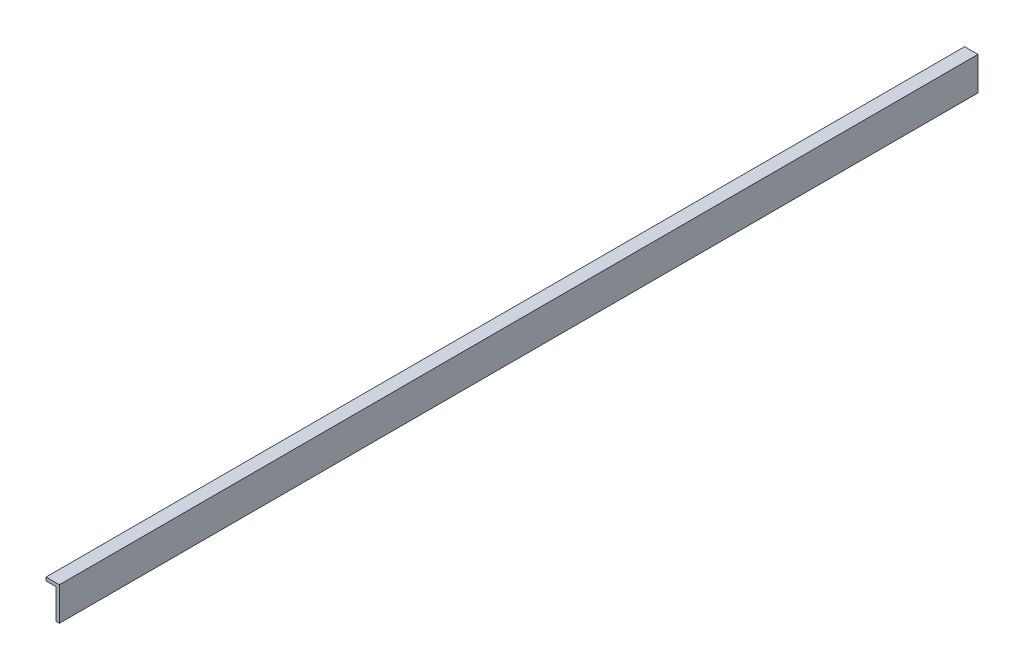
ISO-10303-21;
HEADER;
FILE_DESCRIPTION(('STEP AP214'),'2;1');
FILE_NAME('part.step','',(''),(''),'','','');
FILE_SCHEMA(('AUTOMOTIVE_DESIGN { 1 0 10303 214 1 1 1 1 }'));
ENDSEC;
DATA;
#1=APPLICATION_CONTEXT('core data for automotive mechanical design processes');
#2=APPLICATION_PROTOCOL_DEFINITION('international standard','automotive_design',2000,#1);
#3=PRODUCT_CONTEXT('',#1,'mechanical');
#4=PRODUCT('Part','Part','',(#3));
#5=PRODUCT_RELATED_PRODUCT_CATEGORY('part','',(#4));
#6=PRODUCT_DEFINITION_FORMATION('','',#4);
#7=PRODUCT_DEFINITION_CONTEXT('part definition',#1,'design');
#8=PRODUCT_DEFINITION('design','',#6,#7);
#9=PRODUCT_DEFINITION_SHAPE('','',#8);
#10=(LENGTH_UNIT() NAMED_UNIT(*) SI_UNIT(.MILLI.,.METRE.));
#11=(NAMED_UNIT(*) PLANE_ANGLE_UNIT() SI_UNIT($,.RADIAN.));
#12=(NAMED_UNIT(*) SI_UNIT($,.STERADIAN.) SOLID_ANGLE_UNIT());
#13=UNCERTAINTY_MEASURE_WITH_UNIT(LENGTH_MEASURE(1.E-05),#10,'distance_accuracy_value','');
#14=(GEOMETRIC_REPRESENTATION_CONTEXT(3) GLOBAL_UNCERTAINTY_ASSIGNED_CONTEXT((#13)) GLOBAL_UNIT_ASSIGNED_CONTEXT((#10,
#11,#12)) REPRESENTATION_CONTEXT('',''));
#15=CARTESIAN_POINT('',(0.,0.,0.));
#16=DIRECTION('',(0.,0.,1.));
#17=DIRECTION('',(1.,0.,0.));
#18=AXIS2_PLACEMENT_3D('',#15,#16,#17);
#19=CARTESIAN_POINT('',(164.,888.,-580.));
#20=DIRECTION('',(-1.,0.,0.));
#21=DIRECTION('',(0.,0.,1.));
#22=AXIS2_PLACEMENT_3D('',#19,#20,#21);
#23=PLANE('',#22);
#24=DIRECTION('',(0.,-1.,0.));
#25=VECTOR('',#24,1.);
#26=CARTESIAN_POINT('',(164.,888.,-30.));
#27=LINE('',#26,#25);
#28=CARTESIAN_POINT('',(164.,888.,-30.));
#29=VERTEX_POINT('',#28);
#30=CARTESIAN_POINT('',(164.,870.,-30.));
#31=VERTEX_POINT('',#30);
#32=EDGE_CURVE('E124',#29,#31,#27,.T.);
#33=ORIENTED_EDGE('',*,*,#32,.F.);
#34=DIRECTION('',(0.,0.,1.));
#35=VECTOR('',#34,1.);
#36=CARTESIAN_POINT('',(164.,888.,-580.));
#37=LINE('',#36,#35);
#38=CARTESIAN_POINT('',(164.,888.,-580.));
#39=VERTEX_POINT('',#38);
#40=EDGE_CURVE('E11',#39,#29,#37,.T.);
#41=ORIENTED_EDGE('',*,*,#40,.F.);
#42=DIRECTION('',(0.,-1.,0.));
#43=VECTOR('',#42,1.);
#44=CARTESIAN_POINT('',(164.,888.,-580.));
#45=LINE('',#44,#43);
#46=CARTESIAN_POINT('',(164.,870.,-580.));
#47=VERTEX_POINT('',#46);
#48=EDGE_CURVE('E138',#39,#47,#45,.T.);
#49=ORIENTED_EDGE('',*,*,#48,.T.);
#50=DIRECTION('',(0.,0.,1.));
#51=VECTOR('',#50,1.);
#52=CARTESIAN_POINT('',(164.,870.,-580.));
#53=LINE('',#52,#51);
#54=EDGE_CURVE('E42',#47,#31,#53,.T.);
#55=ORIENTED_EDGE('',*,*,#54,.T.);
#56=EDGE_LOOP('',(#33,#41,#49,#55));
#57=FACE_BOUND('',#56,.T.);
#58=ADVANCED_FACE('F39',(#57),#23,.T.);
#59=CARTESIAN_POINT('',(158.,888.,-580.));
#60=DIRECTION('',(0.,-1.,0.));
#61=DIRECTION('',(0.,0.,-1.));
#62=AXIS2_PLACEMENT_3D('',#59,#60,#61);
#63=PLANE('',#62);
#64=DIRECTION('',(1.,0.,0.));
#65=VECTOR('',#64,1.);
#66=CARTESIAN_POINT('',(158.,888.,-30.));
#67=LINE('',#66,#65);
#68=CARTESIAN_POINT('',(158.,888.,-30.));
#69=VERTEX_POINT('',#68);
#70=EDGE_CURVE('E136',#69,#29,#67,.T.);
#71=ORIENTED_EDGE('',*,*,#70,.F.);
#72=DIRECTION('',(0.,0.,1.));
#73=VECTOR('',#72,1.);
#74=CARTESIAN_POINT('',(158.,888.,-580.));
#75=LINE('',#74,#73);
#76=CARTESIAN_POINT('',(158.,888.,-580.));
#77=VERTEX_POINT('',#76);
#78=EDGE_CURVE('E48',#77,#69,#75,.T.);
#79=ORIENTED_EDGE('',*,*,#78,.F.);
#80=DIRECTION('',(1.,0.,0.));
#81=VECTOR('',#80,1.);
#82=CARTESIAN_POINT('',(158.,888.,-580.));
#83=LINE('',#82,#81);
#84=EDGE_CURVE('E114',#77,#39,#83,.T.);
#85=ORIENTED_EDGE('',*,*,#84,.T.);
#86=ORIENTED_EDGE('',*,*,#40,.T.);
#87=EDGE_LOOP('',(#71,#79,#85,#86));
#88=FACE_BOUND('',#87,.T.);
#89=ADVANCED_FACE('F146',(#88),#63,.T.);
#90=CARTESIAN_POINT('',(158.,890.,-580.));
#91=DIRECTION('',(-1.,0.,0.));
#92=DIRECTION('',(0.,0.,1.));
#93=AXIS2_PLACEMENT_3D('',#90,#91,#92);
#94=PLANE('',#93);
#95=DIRECTION('',(0.,-1.,0.));
#96=VECTOR('',#95,1.);
#97=CARTESIAN_POINT('',(158.,890.,-30.));
#98=LINE('',#97,#96);
#99=CARTESIAN_POINT('',(158.,890.,-30.));
#100=VERTEX_POINT('',#99);
#101=EDGE_CURVE('E101',#100,#69,#98,.T.);
#102=ORIENTED_EDGE('',*,*,#101,.F.);
#103=DIRECTION('',(0.,0.,1.));
#104=VECTOR('',#103,1.);
#105=CARTESIAN_POINT('',(158.,890.,-580.));
#106=LINE('',#105,#104);
#107=CARTESIAN_POINT('',(158.,890.,-580.));
#108=VERTEX_POINT('',#107);
#109=EDGE_CURVE('E96',#108,#100,#106,.T.);
#110=ORIENTED_EDGE('',*,*,#109,.F.);
#111=DIRECTION('',(0.,-1.,0.));
#112=VECTOR('',#111,1.);
#113=CARTESIAN_POINT('',(158.,890.,-580.));
#114=LINE('',#113,#112);
#115=EDGE_CURVE('E99',#108,#77,#114,.T.);
#116=ORIENTED_EDGE('',*,*,#115,.T.);
#117=ORIENTED_EDGE('',*,*,#78,.T.);
#118=EDGE_LOOP('',(#102,#110,#116,#117));
#119=FACE_BOUND('',#118,.T.);
#120=ADVANCED_FACE('F98',(#119),#94,.T.);
#121=CARTESIAN_POINT('',(166.,890.,-580.));
#122=DIRECTION('',(0.,1.,0.));
#123=DIRECTION('',(0.,0.,1.));
#124=AXIS2_PLACEMENT_3D('',#121,#122,#123);
#125=PLANE('',#124);
#126=DIRECTION('',(-1.,0.,0.));
#127=VECTOR('',#126,1.);
#128=CARTESIAN_POINT('',(166.,890.,-30.));
#129=LINE('',#128,#127);
#130=CARTESIAN_POINT('',(166.,890.,-30.));
#131=VERTEX_POINT('',#130);
#132=EDGE_CURVE('E133',#131,#100,#129,.T.);
#133=ORIENTED_EDGE('',*,*,#132,.F.);
#134=DIRECTION('',(0.,0.,1.));
#135=VECTOR('',#134,1.);
#136=CARTESIAN_POINT('',(166.,890.,-580.));
#137=LINE('',#136,#135);
#138=CARTESIAN_POINT('',(166.,890.,-580.));
#139=VERTEX_POINT('',#138);
#140=EDGE_CURVE('E106',#139,#131,#137,.T.);
#141=ORIENTED_EDGE('',*,*,#140,.F.);
#142=DIRECTION('',(-1.,0.,0.));
#143=VECTOR('',#142,1.);
#144=CARTESIAN_POINT('',(166.,890.,-580.));
#145=LINE('',#144,#143);
#146=EDGE_CURVE('E112',#139,#108,#145,.T.);
#147=ORIENTED_EDGE('',*,*,#146,.T.);
#148=ORIENTED_EDGE('',*,*,#109,.T.);
#149=EDGE_LOOP('',(#133,#141,#147,#148));
#150=FACE_BOUND('',#149,.T.);
#151=ADVANCED_FACE('F116',(#150),#125,.T.);
#152=CARTESIAN_POINT('',(166.,870.,-580.));
#153=DIRECTION('',(1.,0.,0.));
#154=DIRECTION('',(0.,0.,-1.));
#155=AXIS2_PLACEMENT_3D('',#152,#153,#154);
#156=PLANE('',#155);
#157=DIRECTION('',(0.,1.,0.));
#158=VECTOR('',#157,1.);
#159=CARTESIAN_POINT('',(166.,870.,-30.));
#160=LINE('',#159,#158);
#161=CARTESIAN_POINT('',(166.,870.,-30.));
#162=VERTEX_POINT('',#161);
#163=EDGE_CURVE('E130',#162,#131,#160,.T.);
#164=ORIENTED_EDGE('',*,*,#163,.F.);
#165=DIRECTION('',(0.,0.,1.));
#166=VECTOR('',#165,1.);
#167=CARTESIAN_POINT('',(166.,870.,-580.));
#168=LINE('',#167,#166);
#169=CARTESIAN_POINT('',(166.,870.,-580.));
#170=VERTEX_POINT('',#169);
#171=EDGE_CURVE('E141',#170,#162,#168,.T.);
#172=ORIENTED_EDGE('',*,*,#171,.F.);
#173=DIRECTION('',(0.,1.,0.));
#174=VECTOR('',#173,1.);
#175=CARTESIAN_POINT('',(166.,870.,-580.));
#176=LINE('',#175,#174);
#177=EDGE_CURVE('E117',#170,#139,#176,.T.);
#178=ORIENTED_EDGE('',*,*,#177,.T.);
#179=ORIENTED_EDGE('',*,*,#140,.T.);
#180=EDGE_LOOP('',(#164,#172,#178,#179));
#181=FACE_BOUND('',#180,.T.);
#182=ADVANCED_FACE('F159',(#181),#156,.T.);
#183=CARTESIAN_POINT('',(164.,870.,-580.));
#184=DIRECTION('',(0.,-1.,0.));
#185=DIRECTION('',(0.,0.,-1.));
#186=AXIS2_PLACEMENT_3D('',#183,#184,#185);
#187=PLANE('',#186);
#188=DIRECTION('',(1.,0.,0.));
#189=VECTOR('',#188,1.);
#190=CARTESIAN_POINT('',(164.,870.,-30.));
#191=LINE('',#190,#189);
#192=EDGE_CURVE('E127',#31,#162,#191,.T.);
#193=ORIENTED_EDGE('',*,*,#192,.F.);
#194=ORIENTED_EDGE('',*,*,#54,.F.);
#195=DIRECTION('',(1.,0.,0.));
#196=VECTOR('',#195,1.);
#197=CARTESIAN_POINT('',(164.,870.,-580.));
#198=LINE('',#197,#196);
#199=EDGE_CURVE('E119',#47,#170,#198,.T.);
#200=ORIENTED_EDGE('',*,*,#199,.T.);
#201=ORIENTED_EDGE('',*,*,#171,.T.);
#202=EDGE_LOOP('',(#193,#194,#200,#201));
#203=FACE_BOUND('',#202,.T.);
#204=ADVANCED_FACE('F143',(#203),#187,.T.);
#205=CARTESIAN_POINT('',(0.,0.,-580.));
#206=DIRECTION('',(0.,0.,1.));
#207=DIRECTION('',(1.,0.,0.));
#208=AXIS2_PLACEMENT_3D('',#205,#206,#207);
#209=PLANE('',#208);
#210=ORIENTED_EDGE('',*,*,#48,.F.);
#211=ORIENTED_EDGE('',*,*,#84,.F.);
#212=ORIENTED_EDGE('',*,*,#115,.F.);
#213=ORIENTED_EDGE('',*,*,#146,.F.);
#214=ORIENTED_EDGE('',*,*,#177,.F.);
#215=ORIENTED_EDGE('',*,*,#199,.F.);
#216=EDGE_LOOP('',(#210,#211,#212,#213,#214,#215));
#217=FACE_BOUND('',#216,.T.);
#218=ADVANCED_FACE('F110',(#217),#209,.F.);
#219=CARTESIAN_POINT('',(0.,0.,-30.));
#220=DIRECTION('',(0.,0.,1.));
#221=DIRECTION('',(1.,0.,0.));
#222=AXIS2_PLACEMENT_3D('',#219,#220,#221);
#223=PLANE('',#222);
#224=ORIENTED_EDGE('',*,*,#32,.T.);
#225=ORIENTED_EDGE('',*,*,#192,.T.);
#226=ORIENTED_EDGE('',*,*,#163,.T.);
#227=ORIENTED_EDGE('',*,*,#132,.T.);
#228=ORIENTED_EDGE('',*,*,#101,.T.);
#229=ORIENTED_EDGE('',*,*,#70,.T.);
#230=EDGE_LOOP('',(#224,#225,#226,#227,#228,#229));
#231=FACE_BOUND('',#230,.T.);
#232=ADVANCED_FACE('F145',(#231),#223,.T.);
#233=CLOSED_SHELL('',(#58,#89,#120,#151,#182,#204,#218,#232));
#234=MANIFOLD_SOLID_BREP('B2',#233);
#235=ADVANCED_BREP_SHAPE_REPRESENTATION('',(#18,#234),#14);
#236=SHAPE_DEFINITION_REPRESENTATION(#9,#235);
ENDSEC;
END-ISO-10303-21;
